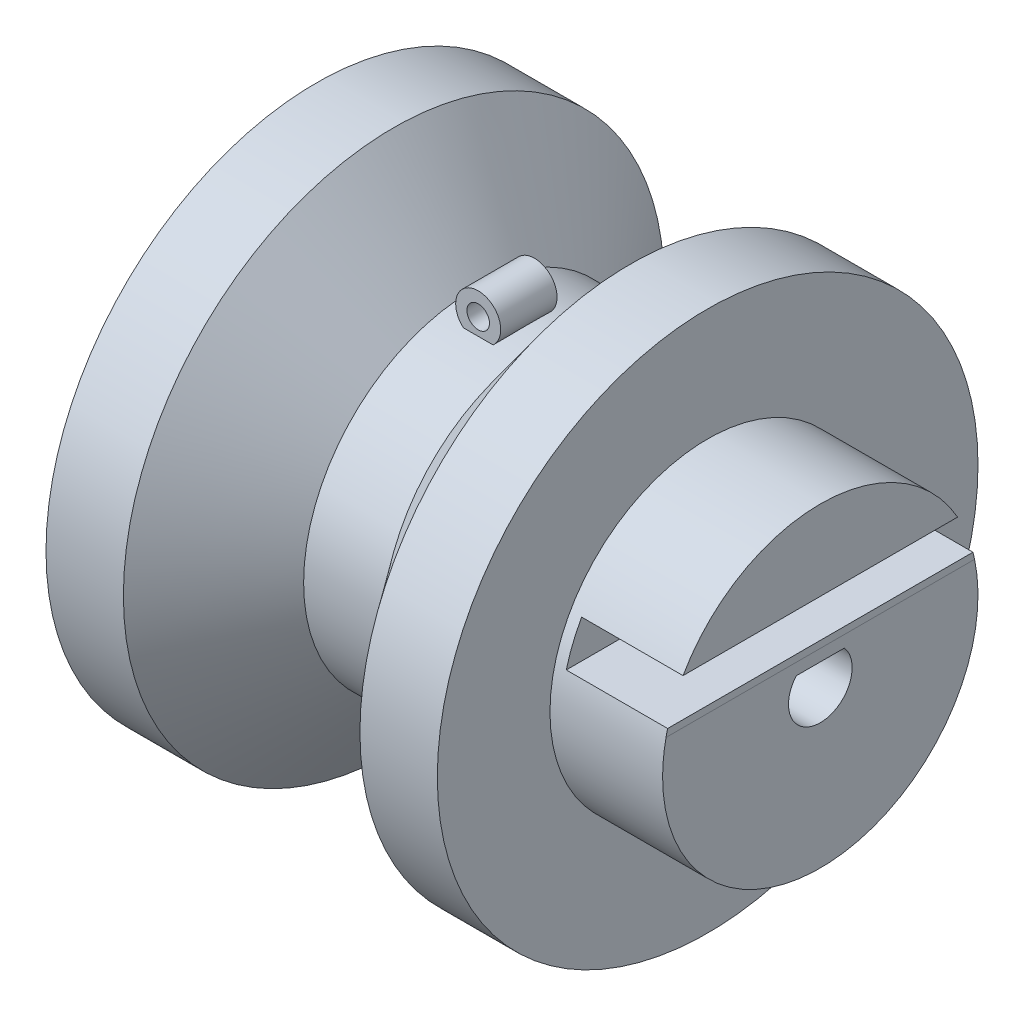
ISO-10303-21;
HEADER;
FILE_DESCRIPTION(('STEP AP214'),'2;1');
FILE_NAME('part.step','',(''),(''),'','','');
FILE_SCHEMA(('AUTOMOTIVE_DESIGN { 1 0 10303 214 1 1 1 1 }'));
ENDSEC;
DATA;
#1=APPLICATION_CONTEXT('core data for automotive mechanical design processes');
#2=APPLICATION_PROTOCOL_DEFINITION('international standard','automotive_design',2000,#1);
#3=PRODUCT_CONTEXT('',#1,'mechanical');
#4=PRODUCT('Part','Part','',(#3));
#5=PRODUCT_RELATED_PRODUCT_CATEGORY('part','',(#4));
#6=PRODUCT_DEFINITION_FORMATION('','',#4);
#7=PRODUCT_DEFINITION_CONTEXT('part definition',#1,'design');
#8=PRODUCT_DEFINITION('design','',#6,#7);
#9=PRODUCT_DEFINITION_SHAPE('','',#8);
#10=(LENGTH_UNIT() NAMED_UNIT(*) SI_UNIT(.MILLI.,.METRE.));
#11=(NAMED_UNIT(*) PLANE_ANGLE_UNIT() SI_UNIT($,.RADIAN.));
#12=(NAMED_UNIT(*) SI_UNIT($,.STERADIAN.) SOLID_ANGLE_UNIT());
#13=UNCERTAINTY_MEASURE_WITH_UNIT(LENGTH_MEASURE(1.E-05),#10,'distance_accuracy_value','');
#14=(GEOMETRIC_REPRESENTATION_CONTEXT(3) GLOBAL_UNCERTAINTY_ASSIGNED_CONTEXT((#13)) GLOBAL_UNIT_ASSIGNED_CONTEXT((#10,
#11,#12)) REPRESENTATION_CONTEXT('',''));
#15=CARTESIAN_POINT('',(0.,0.,0.));
#16=DIRECTION('',(0.,0.,1.));
#17=DIRECTION('',(1.,0.,0.));
#18=AXIS2_PLACEMENT_3D('',#15,#16,#17);
#19=CARTESIAN_POINT('',(44.74,14.,0.));
#20=DIRECTION('',(-1.,0.,0.));
#21=DIRECTION('',(0.,0.,1.));
#22=AXIS2_PLACEMENT_3D('',#19,#20,#21);
#23=PLANE('',#22);
#24=DIRECTION('',(0.,0.,-1.));
#25=VECTOR('',#24,1.);
#26=CARTESIAN_POINT('',(44.74,1.85097792377277,2.60998384332674));
#27=LINE('',#26,#25);
#28=CARTESIAN_POINT('',(44.74,1.85097792377277,2.13412879782497));
#29=VERTEX_POINT('',#28);
#30=CARTESIAN_POINT('',(44.74,1.85097792377277,-2.13412879782497));
#31=VERTEX_POINT('',#30);
#32=EDGE_CURVE('E340',#29,#31,#27,.T.);
#33=ORIENTED_EDGE('',*,*,#32,.T.);
#34=CARTESIAN_POINT('',(44.74,0.,0.));
#35=DIRECTION('',(1.,0.,0.));
#36=DIRECTION('',(0.,0.,-1.));
#37=AXIS2_PLACEMENT_3D('',#34,#35,#36);
#38=CIRCLE('',#37,2.825);
#39=EDGE_CURVE('E344',#29,#31,#38,.T.);
#40=ORIENTED_EDGE('',*,*,#39,.F.);
#41=EDGE_LOOP('',(#33,#40));
#42=FACE_BOUND('',#41,.T.);
#43=DIRECTION('',(0.,0.,-1.));
#44=VECTOR('',#43,1.);
#45=CARTESIAN_POINT('',(44.74,2.8916926259107,12.1510601448769));
#46=LINE('',#45,#44);
#47=CARTESIAN_POINT('',(44.74,2.8916926259107,13.6981062106137));
#48=VERTEX_POINT('',#47);
#49=CARTESIAN_POINT('',(44.74,2.8916926259107,-13.6981062106137));
#50=VERTEX_POINT('',#49);
#51=EDGE_CURVE('E53',#48,#50,#46,.T.);
#52=ORIENTED_EDGE('',*,*,#51,.F.);
#53=CARTESIAN_POINT('',(44.74,0.,0.));
#54=DIRECTION('',(-1.,0.,0.));
#55=DIRECTION('',(0.,0.,1.));
#56=AXIS2_PLACEMENT_3D('',#53,#54,#55);
#57=CIRCLE('',#56,14.);
#58=EDGE_CURVE('E351',#50,#48,#57,.T.);
#59=ORIENTED_EDGE('',*,*,#58,.F.);
#60=EDGE_LOOP('',(#52,#59));
#61=FACE_BOUND('',#60,.T.);
#62=ADVANCED_FACE('F39',(#42,#61),#23,.F.);
#63=CARTESIAN_POINT('',(44.74,6.8916926259107,12.1862452277134));
#64=VERTEX_POINT('',#63);
#65=CARTESIAN_POINT('',(44.74,6.8916926259107,-12.1862452277134));
#66=VERTEX_POINT('',#65);
#67=EDGE_CURVE('E349',#64,#66,#57,.T.);
#68=ORIENTED_EDGE('',*,*,#67,.F.);
#69=DIRECTION('',(0.,0.,-1.));
#70=VECTOR('',#69,1.);
#71=CARTESIAN_POINT('',(44.74,6.8916926259107,0.));
#72=LINE('',#71,#70);
#73=EDGE_CURVE('E382',#64,#66,#72,.T.);
#74=ORIENTED_EDGE('',*,*,#73,.T.);
#75=EDGE_LOOP('',(#68,#74));
#76=FACE_BOUND('',#75,.T.);
#77=ADVANCED_FACE('F245',(#76),#23,.F.);
#78=DIRECTION('',(0.,-0.973500960801579,0.228682923101842));
#79=VECTOR('',#78,1.);
#80=CARTESIAN_POINT('',(44.74,16.4685954183847,10.5087864849341));
#81=LINE('',#80,#79);
#82=CARTESIAN_POINT('',(44.74,3.50978283177401,13.5529120292941));
#83=VERTEX_POINT('',#82);
#84=EDGE_CURVE('E146',#83,#48,#81,.T.);
#85=ORIENTED_EDGE('',*,*,#84,.F.);
#86=EDGE_CURVE('E144',#48,#83,#57,.T.);
#87=ORIENTED_EDGE('',*,*,#86,.F.);
#88=EDGE_LOOP('',(#85,#87));
#89=FACE_BOUND('',#88,.T.);
#90=ADVANCED_FACE('F224',(#89),#23,.F.);
#91=CARTESIAN_POINT('',(35.74,0.,0.));
#92=DIRECTION('',(1.,0.,0.));
#93=DIRECTION('',(0.,0.,-1.));
#94=AXIS2_PLACEMENT_3D('',#91,#92,#93);
#95=PLANE('',#94);
#96=DIRECTION('',(0.,0.,1.));
#97=VECTOR('',#96,1.);
#98=CARTESIAN_POINT('',(35.74,6.8916926259107,12.1510601448769));
#99=LINE('',#98,#97);
#100=CARTESIAN_POINT('',(35.74,6.8916926259107,-12.1862452277134));
#101=VERTEX_POINT('',#100);
#102=CARTESIAN_POINT('',(35.74,6.8916926259107,12.1862452277134));
#103=VERTEX_POINT('',#102);
#104=EDGE_CURVE('E136',#101,#103,#99,.T.);
#105=ORIENTED_EDGE('',*,*,#104,.T.);
#106=CARTESIAN_POINT('',(35.74,0.,0.));
#107=DIRECTION('',(-1.,0.,0.));
#108=DIRECTION('',(0.,0.,1.));
#109=AXIS2_PLACEMENT_3D('',#106,#107,#108);
#110=CIRCLE('',#109,14.);
#111=CARTESIAN_POINT('',(35.74,3.50978283177401,13.5529120292941));
#112=VERTEX_POINT('',#111);
#113=EDGE_CURVE('E133',#112,#103,#110,.T.);
#114=ORIENTED_EDGE('',*,*,#113,.F.);
#115=DIRECTION('',(0.,0.,1.));
#116=VECTOR('',#115,1.);
#117=CARTESIAN_POINT('',(35.74,3.50978283177401,13.5529120292941));
#118=LINE('',#117,#116);
#119=CARTESIAN_POINT('',(35.74,3.50978283177401,-13.5529120292941));
#120=VERTEX_POINT('',#119);
#121=EDGE_CURVE('E61',#120,#112,#118,.T.);
#122=ORIENTED_EDGE('',*,*,#121,.F.);
#123=CARTESIAN_POINT('',(35.74,0.,0.));
#124=DIRECTION('',(1.,0.,0.));
#125=DIRECTION('',(0.,0.,-1.));
#126=AXIS2_PLACEMENT_3D('',#123,#124,#125);
#127=CIRCLE('',#126,14.);
#128=EDGE_CURVE('E385',#120,#101,#127,.T.);
#129=ORIENTED_EDGE('',*,*,#128,.T.);
#130=EDGE_LOOP('',(#105,#114,#122,#129));
#131=FACE_BOUND('',#130,.T.);
#132=ADVANCED_FACE('F134',(#131),#95,.T.);
#133=CARTESIAN_POINT('',(-743.156397809563,0.,0.));
#134=DIRECTION('',(-1.,0.,0.));
#135=DIRECTION('',(0.,0.,1.));
#136=AXIS2_PLACEMENT_3D('',#133,#134,#135);
#137=CYLINDRICAL_SURFACE('',#136,15.);
#138=CARTESIAN_POINT('',(20.8700000000001,0.,0.));
#139=DIRECTION('',(-1.,0.,0.));
#140=DIRECTION('',(0.,0.,1.));
#141=AXIS2_PLACEMENT_3D('',#138,#139,#140);
#142=CIRCLE('',#141,15.);
#143=CARTESIAN_POINT('',(20.8700000000001,0.,15.));
#144=VERTEX_POINT('',#143);
#145=EDGE_CURVE('E362',#144,#144,#142,.T.);
#146=ORIENTED_EDGE('',*,*,#145,.T.);
#147=EDGE_LOOP('',(#146));
#148=FACE_BOUND('',#147,.T.);
#149=CARTESIAN_POINT('',(13.87,0.,0.));
#150=DIRECTION('',(-1.,0.,0.));
#151=DIRECTION('',(0.,0.,1.));
#152=AXIS2_PLACEMENT_3D('',#149,#150,#151);
#153=CIRCLE('',#152,15.);
#154=CARTESIAN_POINT('',(13.87,0.,15.));
#155=VERTEX_POINT('',#154);
#156=EDGE_CURVE('E365',#155,#155,#153,.T.);
#157=ORIENTED_EDGE('',*,*,#156,.F.);
#158=EDGE_LOOP('',(#157));
#159=FACE_BOUND('',#158,.T.);
#160=CARTESIAN_POINT('',(18.6893960728491,14.6969384566991,3.));
#161=CARTESIAN_POINT('',(18.7040610291489,14.7098161919238,2.93691462350065));
#162=CARTESIAN_POINT('',(18.717882698051,14.7223238782577,2.87356435946661));
#163=CARTESIAN_POINT('',(18.7439977964036,14.7465728184512,2.74641139489665));
#164=CARTESIAN_POINT('',(18.7562914100933,14.758314164628,2.6826087498872));
#165=CARTESIAN_POINT('',(18.7911096736137,14.7923411112686,2.49068646675242));
#166=CARTESIAN_POINT('',(18.811587700297,14.8134439978394,2.3619821585127));
#167=CARTESIAN_POINT('',(18.8480076298798,14.8523352513787,2.10361316019437));
#168=CARTESIAN_POINT('',(18.8639549844343,14.8701275928746,1.97394981860906));
#169=CARTESIAN_POINT('',(18.892026407053,14.9023533787343,1.71378346857584));
#170=CARTESIAN_POINT('',(18.9041499055225,14.9167863226045,1.58328033798597));
#171=CARTESIAN_POINT('',(18.9352445676458,14.954568877835,1.19490664119092));
#172=CARTESIAN_POINT('',(18.9494671984609,14.9730062785305,0.936157608819902));
#173=CARTESIAN_POINT('',(18.9673812871013,14.9964312981597,0.417656023941576));
#174=CARTESIAN_POINT('',(18.9710702115417,15.0014156815907,0.15790324506921));
#175=CARTESIAN_POINT('',(18.968930743925,14.9985813195935,-0.260063844880724));
#176=CARTESIAN_POINT('',(18.9662550448626,14.9950003885739,-0.418338908711629));
#177=CARTESIAN_POINT('',(18.957004475162,14.9828396607237,-0.734529680897843));
#178=CARTESIAN_POINT('',(18.9504310464235,14.9742617124765,-0.892445500474776));
#179=CARTESIAN_POINT('',(18.9329409787209,14.9520341102201,-1.20917778892372));
#180=CARTESIAN_POINT('',(18.9219842731021,14.9383377480735,-1.36798885775123));
#181=CARTESIAN_POINT('',(18.9018015469766,14.9140399759554,-1.60553861995131));
#182=CARTESIAN_POINT('',(18.8944466685123,14.9053120874341,-1.68463370127467));
#183=CARTESIAN_POINT('',(18.8783681457212,14.8866169198247,-1.8425416596438));
#184=CARTESIAN_POINT('',(18.8696444296127,14.8766495757454,-1.92135452166819));
#185=CARTESIAN_POINT('',(18.8601769737583,14.8660687473185,-2.));
#186=B_SPLINE_CURVE_WITH_KNOTS('',3,(#160,#161,#162,#163,#164,#165,#166,#167,#168,#169,#170,
#171,#172,#173,#174,#175,#176,#177,#178,#179,#180,#181,#182,#183,#184,#185),.UNSPECIFIED.,.F.,
.F.,(4,2,2,2,2,2,2,2,2,2,2,2,4),(0.,0.198088605508149,0.396153304062786,0.792062376956047,
1.18749302400516,1.58298254591454,2.36171158582709,3.14062789640457,3.61552926173727,
4.0902550547849,4.56942316790253,4.80914707619131,5.04888355978083),.UNSPECIFIED.);
#187=CARTESIAN_POINT('',(18.6893960728491,14.6969384566991,3.));
#188=VERTEX_POINT('',#187);
#189=CARTESIAN_POINT('',(18.8601769737583,14.8660687473185,-2.));
#190=VERTEX_POINT('',#189);
#191=EDGE_CURVE('E148',#188,#190,#186,.T.);
#192=ORIENTED_EDGE('',*,*,#191,.F.);
#193=DIRECTION('',(-1.,0.,0.));
#194=VECTOR('',#193,1.);
#195=CARTESIAN_POINT('',(-743.156397809563,14.6969384566991,3.));
#196=LINE('',#195,#194);
#197=CARTESIAN_POINT('',(16.050603927151,14.6969384566991,3.));
#198=VERTEX_POINT('',#197);
#199=EDGE_CURVE('E200',#188,#198,#196,.T.);
#200=ORIENTED_EDGE('',*,*,#199,.T.);
#201=CARTESIAN_POINT('',(15.8798230262418,14.8660687473185,-2.));
#202=CARTESIAN_POINT('',(15.870375643507,14.8766270802858,-1.9215216609567));
#203=CARTESIAN_POINT('',(15.8616689143144,14.8865745429538,-1.84287668048276));
#204=CARTESIAN_POINT('',(15.8456188311979,14.9052352066879,-1.68530583199752));
#205=CARTESIAN_POINT('',(15.8382754013861,14.9139484764487,-1.60637997987031));
#206=CARTESIAN_POINT('',(15.8181146414368,14.938216385277,-1.36928069895072));
#207=CARTESIAN_POINT('',(15.8071628630908,14.9519036939852,-1.21075161133191));
#208=CARTESIAN_POINT('',(15.789578736239,14.974247761487,-0.892925909158902));
#209=CARTESIAN_POINT('',(15.7829514145344,14.9828986646472,-0.733628617449837));
#210=CARTESIAN_POINT('',(15.7736569738617,14.9951149920446,-0.414716800602474));
#211=CARTESIAN_POINT('',(15.7709900328092,14.9986801878117,-0.255102261534717));
#212=CARTESIAN_POINT('',(15.7694811569605,15.0006916826448,0.060943090110886));
#213=CARTESIAN_POINT('',(15.7705628586212,14.9992401784582,0.217372920525811));
#214=CARTESIAN_POINT('',(15.7764422770488,14.9914479284801,0.530040534257766));
#215=CARTESIAN_POINT('',(15.7812399412347,14.9851072518704,0.686278320260896));
#216=CARTESIAN_POINT('',(15.7948098733402,14.9675637502191,0.998209687963734));
#217=CARTESIAN_POINT('',(15.8035796174892,14.9563640127058,1.15390355205718));
#218=CARTESIAN_POINT('',(15.8255772870003,14.9291469263377,1.46453795288114));
#219=CARTESIAN_POINT('',(15.838804471217,14.9131303784289,1.6194786105067));
#220=CARTESIAN_POINT('',(15.865236201923,14.8824467731514,1.87712406404114));
#221=CARTESIAN_POINT('',(15.8769975966152,14.8690893717887,1.98013505242891));
#222=CARTESIAN_POINT('',(15.9031739383018,14.8402944410675,2.18549976850785));
#223=CARTESIAN_POINT('',(15.9175881088593,14.8248575207136,2.28785367946993));
#224=CARTESIAN_POINT('',(15.9495726704717,14.7918360028383,2.49246692795308));
#225=CARTESIAN_POINT('',(15.9671641230574,14.774237341009,2.59472075519171));
#226=CARTESIAN_POINT('',(16.006002261356,14.7370550351076,2.7982025998532));
#227=CARTESIAN_POINT('',(16.0272502241691,14.7174706984888,2.89943024573956));
#228=CARTESIAN_POINT('',(16.0506039271507,14.6969384566991,3.00000000000003));
#229=B_SPLINE_CURVE_WITH_KNOTS('',3,(#201,#202,#203,#204,#205,#206,#207,#208,#209,#210,#211,
#212,#213,#214,#215,#216,#217,#218,#219,#220,#221,#222,#223,#224,#225,#226,#227,#228),
.UNSPECIFIED.,.F.,.F.,(4,2,2,2,2,2,2,2,2,2,2,2,2,4),(0.,0.23922696357834,0.47844060664154,
0.95676457673524,1.43564357062519,1.91454407696938,2.38374674771456,2.85294277935444,
3.32184111164863,3.79066151793414,4.10422394537538,4.41769474226264,4.73332529385628,
5.04906630952006),.UNSPECIFIED.);
#230=CARTESIAN_POINT('',(15.8798230262418,14.8660687473185,-2.));
#231=VERTEX_POINT('',#230);
#232=EDGE_CURVE('E187',#231,#198,#229,.T.);
#233=ORIENTED_EDGE('',*,*,#232,.F.);
#234=DIRECTION('',(-1.,0.,0.));
#235=VECTOR('',#234,1.);
#236=CARTESIAN_POINT('',(-743.156397809563,14.8660687473185,-2.));
#237=LINE('',#236,#235);
#238=EDGE_CURVE('E321',#190,#231,#237,.T.);
#239=ORIENTED_EDGE('',*,*,#238,.F.);
#240=EDGE_LOOP('',(#192,#200,#233,#239));
#241=FACE_BOUND('',#240,.T.);
#242=ADVANCED_FACE('F180',(#148,#159,#241),#137,.T.);
#243=CARTESIAN_POINT('',(0.,0.,0.));
#244=DIRECTION('',(1.,0.,0.));
#245=DIRECTION('',(0.,0.,-1.));
#246=AXIS2_PLACEMENT_3D('',#243,#244,#245);
#247=PLANE('',#246);
#248=CARTESIAN_POINT('',(0.,0.,0.));
#249=DIRECTION('',(-1.,0.,0.));
#250=DIRECTION('',(0.,0.,1.));
#251=AXIS2_PLACEMENT_3D('',#248,#249,#250);
#252=CIRCLE('',#251,24.);
#253=CARTESIAN_POINT('',(0.,0.,24.));
#254=VERTEX_POINT('',#253);
#255=EDGE_CURVE('E371',#254,#254,#252,.T.);
#256=ORIENTED_EDGE('',*,*,#255,.T.);
#257=EDGE_LOOP('',(#256));
#258=FACE_BOUND('',#257,.T.);
#259=ADVANCED_FACE('F41',(#258),#247,.F.);
#260=CARTESIAN_POINT('',(-743.156397809563,0.,0.));
#261=DIRECTION('',(-1.,0.,0.));
#262=DIRECTION('',(0.,0.,1.));
#263=AXIS2_PLACEMENT_3D('',#260,#261,#262);
#264=CYLINDRICAL_SURFACE('',#263,24.);
#265=ORIENTED_EDGE('',*,*,#255,.F.);
#266=EDGE_LOOP('',(#265));
#267=FACE_BOUND('',#266,.T.);
#268=CARTESIAN_POINT('',(6.87000000000004,0.,0.));
#269=DIRECTION('',(-1.,0.,0.));
#270=DIRECTION('',(0.,0.,1.));
#271=AXIS2_PLACEMENT_3D('',#268,#269,#270);
#272=CIRCLE('',#271,24.);
#273=CARTESIAN_POINT('',(6.87000000000004,0.,24.));
#274=VERTEX_POINT('',#273);
#275=EDGE_CURVE('E368',#274,#274,#272,.T.);
#276=ORIENTED_EDGE('',*,*,#275,.T.);
#277=EDGE_LOOP('',(#276));
#278=FACE_BOUND('',#277,.T.);
#279=ADVANCED_FACE('F521',(#267,#278),#264,.T.);
#280=CARTESIAN_POINT('',(13.87,0.,0.));
#281=DIRECTION('',(-1.,0.,0.));
#282=DIRECTION('',(0.,0.,1.));
#283=AXIS2_PLACEMENT_3D('',#280,#281,#282);
#284=CONICAL_SURFACE('',#283,15.,0.909753157944209);
#285=ORIENTED_EDGE('',*,*,#275,.F.);
#286=EDGE_LOOP('',(#285));
#287=FACE_BOUND('',#286,.T.);
#288=ORIENTED_EDGE('',*,*,#156,.T.);
#289=EDGE_LOOP('',(#288));
#290=FACE_BOUND('',#289,.T.);
#291=ADVANCED_FACE('F178',(#287,#290),#284,.T.);
#292=CARTESIAN_POINT('',(27.87,0.,0.));
#293=DIRECTION('',(1.,0.,0.));
#294=DIRECTION('',(0.,0.,-1.));
#295=AXIS2_PLACEMENT_3D('',#292,#293,#294);
#296=CONICAL_SURFACE('',#295,24.,0.909753157944217);
#297=ORIENTED_EDGE('',*,*,#145,.F.);
#298=EDGE_LOOP('',(#297));
#299=FACE_BOUND('',#298,.T.);
#300=CARTESIAN_POINT('',(27.87,0.,0.));
#301=DIRECTION('',(-1.,0.,0.));
#302=DIRECTION('',(0.,0.,1.));
#303=AXIS2_PLACEMENT_3D('',#300,#301,#302);
#304=CIRCLE('',#303,24.);
#305=CARTESIAN_POINT('',(27.87,0.,24.));
#306=VERTEX_POINT('',#305);
#307=EDGE_CURVE('E359',#306,#306,#304,.T.);
#308=ORIENTED_EDGE('',*,*,#307,.T.);
#309=EDGE_LOOP('',(#308));
#310=FACE_BOUND('',#309,.T.);
#311=ADVANCED_FACE('F174',(#299,#310),#296,.T.);
#312=CARTESIAN_POINT('',(-743.156397809563,0.,0.));
#313=DIRECTION('',(-1.,0.,0.));
#314=DIRECTION('',(0.,0.,1.));
#315=AXIS2_PLACEMENT_3D('',#312,#313,#314);
#316=CYLINDRICAL_SURFACE('',#315,24.);
#317=ORIENTED_EDGE('',*,*,#307,.F.);
#318=EDGE_LOOP('',(#317));
#319=FACE_BOUND('',#318,.T.);
#320=CARTESIAN_POINT('',(34.74,0.,0.));
#321=DIRECTION('',(-1.,0.,0.));
#322=DIRECTION('',(0.,0.,1.));
#323=AXIS2_PLACEMENT_3D('',#320,#321,#322);
#324=CIRCLE('',#323,24.);
#325=CARTESIAN_POINT('',(34.74,0.,24.));
#326=VERTEX_POINT('',#325);
#327=EDGE_CURVE('E356',#326,#326,#324,.T.);
#328=ORIENTED_EDGE('',*,*,#327,.T.);
#329=EDGE_LOOP('',(#328));
#330=FACE_BOUND('',#329,.T.);
#331=ADVANCED_FACE('F170',(#319,#330),#316,.T.);
#332=CARTESIAN_POINT('',(34.74,24.,0.));
#333=DIRECTION('',(-1.,0.,0.));
#334=DIRECTION('',(0.,0.,1.));
#335=AXIS2_PLACEMENT_3D('',#332,#333,#334);
#336=PLANE('',#335);
#337=ORIENTED_EDGE('',*,*,#327,.F.);
#338=EDGE_LOOP('',(#337));
#339=FACE_BOUND('',#338,.T.);
#340=CARTESIAN_POINT('',(34.74,0.,0.));
#341=DIRECTION('',(-1.,0.,0.));
#342=DIRECTION('',(0.,0.,1.));
#343=AXIS2_PLACEMENT_3D('',#340,#341,#342);
#344=CIRCLE('',#343,14.);
#345=CARTESIAN_POINT('',(34.74,0.,14.));
#346=VERTEX_POINT('',#345);
#347=EDGE_CURVE('E353',#346,#346,#344,.T.);
#348=ORIENTED_EDGE('',*,*,#347,.T.);
#349=EDGE_LOOP('',(#348));
#350=FACE_BOUND('',#349,.T.);
#351=ADVANCED_FACE('F166',(#339,#350),#336,.F.);
#352=CARTESIAN_POINT('',(-743.156397809563,0.,0.));
#353=DIRECTION('',(-1.,0.,0.));
#354=DIRECTION('',(0.,0.,1.));
#355=AXIS2_PLACEMENT_3D('',#352,#353,#354);
#356=CYLINDRICAL_SURFACE('',#355,14.);
#357=ORIENTED_EDGE('',*,*,#113,.T.);
#358=DIRECTION('',(-1.,0.,0.));
#359=VECTOR('',#358,1.);
#360=CARTESIAN_POINT('',(-743.156397809563,6.8916926259107,12.1862452277134));
#361=LINE('',#360,#359);
#362=EDGE_CURVE('E12',#103,#64,#361,.F.);
#363=ORIENTED_EDGE('',*,*,#362,.T.);
#364=ORIENTED_EDGE('',*,*,#67,.T.);
#365=DIRECTION('',(-1.,0.,0.));
#366=VECTOR('',#365,1.);
#367=CARTESIAN_POINT('',(-743.156397809563,6.8916926259107,-12.1862452277134));
#368=LINE('',#367,#366);
#369=EDGE_CURVE('E337',#66,#101,#368,.T.);
#370=ORIENTED_EDGE('',*,*,#369,.T.);
#371=ORIENTED_EDGE('',*,*,#128,.F.);
#372=CARTESIAN_POINT('',(35.74,2.8916926259107,-13.6981062106137));
#373=DIRECTION('',(0.,0.973500960801579,0.228682923101842));
#374=VECTOR('',#373,1.);
#375=LINE('',#372,#374);
#376=CARTESIAN_POINT('',(35.74,2.8916926259107,-13.6981062106137));
#377=VERTEX_POINT('',#376);
#378=EDGE_CURVE('E130',#377,#120,#375,.T.);
#379=ORIENTED_EDGE('',*,*,#378,.F.);
#380=DIRECTION('',(1.,0.,0.));
#381=VECTOR('',#380,1.);
#382=CARTESIAN_POINT('',(35.74,2.8916926259107,-13.6981062106137));
#383=LINE('',#382,#381);
#384=EDGE_CURVE('E335',#377,#50,#383,.T.);
#385=ORIENTED_EDGE('',*,*,#384,.T.);
#386=ORIENTED_EDGE('',*,*,#58,.T.);
#387=ORIENTED_EDGE('',*,*,#86,.T.);
#388=DIRECTION('',(-1.,0.,0.));
#389=VECTOR('',#388,1.);
#390=CARTESIAN_POINT('',(-743.156397809563,3.50978283177401,13.5529120292941));
#391=LINE('',#390,#389);
#392=EDGE_CURVE('E47',#83,#112,#391,.T.);
#393=ORIENTED_EDGE('',*,*,#392,.T.);
#394=EDGE_LOOP('',(#357,#363,#364,#370,#371,#379,#385,#386,#387,#393));
#395=FACE_BOUND('',#394,.T.);
#396=ORIENTED_EDGE('',*,*,#347,.F.);
#397=EDGE_LOOP('',(#396));
#398=FACE_BOUND('',#397,.T.);
#399=ADVANCED_FACE('F141',(#395,#398),#356,.T.);
#400=CARTESIAN_POINT('',(9.74,0.,0.));
#401=DIRECTION('',(1.,0.,0.));
#402=DIRECTION('',(0.,0.,-1.));
#403=AXIS2_PLACEMENT_3D('',#400,#401,#402);
#404=CYLINDRICAL_SURFACE('',#403,2.825);
#405=ORIENTED_EDGE('',*,*,#39,.T.);
#406=DIRECTION('',(1.,0.,0.));
#407=VECTOR('',#406,1.);
#408=CARTESIAN_POINT('',(9.74,1.85097792377277,-2.13412879782497));
#409=LINE('',#408,#407);
#410=CARTESIAN_POINT('',(14.74,1.85097792377277,-2.13412879782497));
#411=VERTEX_POINT('',#410);
#412=EDGE_CURVE('E379',#31,#411,#409,.F.);
#413=ORIENTED_EDGE('',*,*,#412,.T.);
#414=CARTESIAN_POINT('',(14.74,0.,0.));
#415=DIRECTION('',(1.,0.,0.));
#416=DIRECTION('',(0.,0.,-1.));
#417=AXIS2_PLACEMENT_3D('',#414,#415,#416);
#418=CIRCLE('',#417,2.825);
#419=CARTESIAN_POINT('',(14.74,1.85097792377277,2.13412879782497));
#420=VERTEX_POINT('',#419);
#421=EDGE_CURVE('E374',#420,#411,#418,.F.);
#422=ORIENTED_EDGE('',*,*,#421,.F.);
#423=DIRECTION('',(1.,0.,0.));
#424=VECTOR('',#423,1.);
#425=CARTESIAN_POINT('',(9.74,1.85097792377277,2.13412879782497));
#426=LINE('',#425,#424);
#427=EDGE_CURVE('E376',#420,#29,#426,.T.);
#428=ORIENTED_EDGE('',*,*,#427,.T.);
#429=EDGE_LOOP('',(#405,#413,#422,#428));
#430=FACE_BOUND('',#429,.T.);
#431=CARTESIAN_POINT('',(9.74,0.,0.));
#432=DIRECTION('',(1.,0.,0.));
#433=DIRECTION('',(0.,0.,-1.));
#434=AXIS2_PLACEMENT_3D('',#431,#432,#433);
#435=CIRCLE('',#434,2.825);
#436=CARTESIAN_POINT('',(9.74,0.,-2.825));
#437=VERTEX_POINT('',#436);
#438=EDGE_CURVE('E346',#437,#437,#435,.T.);
#439=ORIENTED_EDGE('',*,*,#438,.F.);
#440=EDGE_LOOP('',(#439));
#441=FACE_BOUND('',#440,.T.);
#442=ADVANCED_FACE('F165',(#430,#441),#404,.F.);
#443=CARTESIAN_POINT('',(9.74,0.,0.));
#444=DIRECTION('',(1.,0.,0.));
#445=DIRECTION('',(0.,0.,-1.));
#446=AXIS2_PLACEMENT_3D('',#443,#444,#445);
#447=PLANE('',#446);
#448=ORIENTED_EDGE('',*,*,#438,.T.);
#449=EDGE_LOOP('',(#448));
#450=FACE_BOUND('',#449,.T.);
#451=ADVANCED_FACE('F235',(#450),#447,.T.);
#452=CARTESIAN_POINT('',(14.74,1.85097792377277,2.60998384332674));
#453=DIRECTION('',(0.,-1.,0.));
#454=DIRECTION('',(0.,0.,-1.));
#455=AXIS2_PLACEMENT_3D('',#452,#453,#454);
#456=PLANE('',#455);
#457=CARTESIAN_POINT('',(29.9566790366801,1.85097792377277,0.));
#458=DIRECTION('',(0.,-1.,0.));
#459=DIRECTION('',(0.,0.,-1.));
#460=AXIS2_PLACEMENT_3D('',#457,#458,#459);
#461=CIRCLE('',#460,1.43);
#462=CARTESIAN_POINT('',(29.9566790366801,1.85097792377277,-1.43));
#463=VERTEX_POINT('',#462);
#464=EDGE_CURVE('E328',#463,#463,#461,.T.);
#465=ORIENTED_EDGE('',*,*,#464,.F.);
#466=EDGE_LOOP('',(#465));
#467=FACE_BOUND('',#466,.T.);
#468=ORIENTED_EDGE('',*,*,#412,.F.);
#469=ORIENTED_EDGE('',*,*,#32,.F.);
#470=ORIENTED_EDGE('',*,*,#427,.F.);
#471=DIRECTION('',(0.,0.,-1.));
#472=VECTOR('',#471,1.);
#473=CARTESIAN_POINT('',(14.74,1.85097792377277,2.60998384332674));
#474=LINE('',#473,#472);
#475=EDGE_CURVE('E341',#420,#411,#474,.T.);
#476=ORIENTED_EDGE('',*,*,#475,.T.);
#477=EDGE_LOOP('',(#468,#469,#470,#476));
#478=FACE_BOUND('',#477,.T.);
#479=ADVANCED_FACE('F231',(#467,#478),#456,.T.);
#480=CARTESIAN_POINT('',(14.74,0.,0.));
#481=DIRECTION('',(1.,0.,0.));
#482=DIRECTION('',(0.,0.,-1.));
#483=AXIS2_PLACEMENT_3D('',#480,#481,#482);
#484=PLANE('',#483);
#485=ORIENTED_EDGE('',*,*,#421,.T.);
#486=ORIENTED_EDGE('',*,*,#475,.F.);
#487=EDGE_LOOP('',(#485,#486));
#488=FACE_BOUND('',#487,.T.);
#489=ADVANCED_FACE('F227',(#488),#484,.F.);
#490=CARTESIAN_POINT('',(35.74,6.8916926259107,12.1510601448769));
#491=DIRECTION('',(0.,1.,0.));
#492=DIRECTION('',(0.,0.,1.));
#493=AXIS2_PLACEMENT_3D('',#490,#491,#492);
#494=PLANE('',#493);
#495=ORIENTED_EDGE('',*,*,#73,.F.);
#496=ORIENTED_EDGE('',*,*,#362,.F.);
#497=ORIENTED_EDGE('',*,*,#104,.F.);
#498=ORIENTED_EDGE('',*,*,#369,.F.);
#499=EDGE_LOOP('',(#495,#496,#497,#498));
#500=FACE_BOUND('',#499,.T.);
#501=ADVANCED_FACE('F220',(#500),#494,.F.);
#502=CARTESIAN_POINT('',(29.9566790366801,0.,0.));
#503=DIRECTION('',(0.,1.,0.));
#504=DIRECTION('',(0.,0.,1.));
#505=AXIS2_PLACEMENT_3D('',#502,#503,#504);
#506=CYLINDRICAL_SURFACE('',#505,1.43);
#507=ORIENTED_EDGE('',*,*,#464,.T.);
#508=EDGE_LOOP('',(#507));
#509=FACE_BOUND('',#508,.T.);
#510=CARTESIAN_POINT('',(29.9566790366801,22.,0.));
#511=DIRECTION('',(0.,1.,0.));
#512=DIRECTION('',(0.,0.,1.));
#513=AXIS2_PLACEMENT_3D('',#510,#511,#512);
#514=CIRCLE('',#513,1.43);
#515=CARTESIAN_POINT('',(29.9566790366801,22.,1.43));
#516=VERTEX_POINT('',#515);
#517=EDGE_CURVE('E324',#516,#516,#514,.T.);
#518=ORIENTED_EDGE('',*,*,#517,.T.);
#519=EDGE_LOOP('',(#518));
#520=FACE_BOUND('',#519,.T.);
#521=ADVANCED_FACE('F216',(#509,#520),#506,.F.);
#522=CARTESIAN_POINT('',(29.9566790366801,22.,0.));
#523=DIRECTION('',(0.,1.,0.));
#524=DIRECTION('',(0.,0.,1.));
#525=AXIS2_PLACEMENT_3D('',#522,#523,#524);
#526=PLANE('',#525);
#527=ORIENTED_EDGE('',*,*,#517,.F.);
#528=EDGE_LOOP('',(#527));
#529=FACE_BOUND('',#528,.T.);
#530=ADVANCED_FACE('F211',(#529),#526,.F.);
#531=CARTESIAN_POINT('',(17.3700000000001,16.2000000000001,3.));
#532=DIRECTION('',(0.,0.,1.));
#533=DIRECTION('',(1.,0.,0.));
#534=AXIS2_PLACEMENT_3D('',#531,#532,#533);
#535=PLANE('',#534);
#536=CARTESIAN_POINT('',(17.3700000000001,16.2000000000001,3.));
#537=DIRECTION('',(0.,0.,1.));
#538=DIRECTION('',(1.,0.,0.));
#539=AXIS2_PLACEMENT_3D('',#536,#537,#538);
#540=CIRCLE('',#539,1.);
#541=CARTESIAN_POINT('',(18.3700000000001,16.2000000000001,3.));
#542=VERTEX_POINT('',#541);
#543=EDGE_CURVE('E314',#542,#542,#540,.T.);
#544=ORIENTED_EDGE('',*,*,#543,.F.);
#545=EDGE_LOOP('',(#544));
#546=FACE_BOUND('',#545,.T.);
#547=ORIENTED_EDGE('',*,*,#199,.F.);
#548=CARTESIAN_POINT('',(17.3700000000001,16.2000000000001,3.));
#549=DIRECTION('',(0.,0.,1.));
#550=DIRECTION('',(1.,0.,0.));
#551=AXIS2_PLACEMENT_3D('',#548,#549,#550);
#552=CIRCLE('',#551,2.);
#553=EDGE_CURVE('E318',#188,#198,#552,.T.);
#554=ORIENTED_EDGE('',*,*,#553,.T.);
#555=EDGE_LOOP('',(#547,#554));
#556=FACE_BOUND('',#555,.T.);
#557=ADVANCED_FACE('F215',(#546,#556),#535,.T.);
#558=CARTESIAN_POINT('',(17.3700000000001,16.2000000000001,-2.));
#559=DIRECTION('',(0.,0.,1.));
#560=DIRECTION('',(1.,0.,0.));
#561=AXIS2_PLACEMENT_3D('',#558,#559,#560);
#562=PLANE('',#561);
#563=CARTESIAN_POINT('',(17.3700000000001,16.2000000000001,-2.));
#564=DIRECTION('',(0.,0.,1.));
#565=DIRECTION('',(1.,0.,0.));
#566=AXIS2_PLACEMENT_3D('',#563,#564,#565);
#567=CIRCLE('',#566,1.);
#568=CARTESIAN_POINT('',(18.3700000000001,16.2000000000001,-2.));
#569=VERTEX_POINT('',#568);
#570=EDGE_CURVE('E279',#569,#569,#567,.T.);
#571=ORIENTED_EDGE('',*,*,#570,.T.);
#572=EDGE_LOOP('',(#571));
#573=FACE_BOUND('',#572,.T.);
#574=CARTESIAN_POINT('',(17.3700000000001,16.2000000000001,-2.));
#575=DIRECTION('',(0.,0.,1.));
#576=DIRECTION('',(1.,0.,0.));
#577=AXIS2_PLACEMENT_3D('',#574,#575,#576);
#578=CIRCLE('',#577,2.);
#579=EDGE_CURVE('E325',#190,#231,#578,.T.);
#580=ORIENTED_EDGE('',*,*,#579,.F.);
#581=ORIENTED_EDGE('',*,*,#238,.T.);
#582=EDGE_LOOP('',(#580,#581));
#583=FACE_BOUND('',#582,.T.);
#584=ADVANCED_FACE('F208',(#573,#583),#562,.F.);
#585=CARTESIAN_POINT('',(17.3700000000001,16.2000000000001,3.));
#586=DIRECTION('',(0.,0.,-1.));
#587=DIRECTION('',(-1.,0.,0.));
#588=AXIS2_PLACEMENT_3D('',#585,#586,#587);
#589=CYLINDRICAL_SURFACE('',#588,2.);
#590=ORIENTED_EDGE('',*,*,#553,.F.);
#591=ORIENTED_EDGE('',*,*,#191,.T.);
#592=ORIENTED_EDGE('',*,*,#579,.T.);
#593=ORIENTED_EDGE('',*,*,#232,.T.);
#594=EDGE_LOOP('',(#590,#591,#592,#593));
#595=FACE_BOUND('',#594,.T.);
#596=ADVANCED_FACE('F202',(#595),#589,.T.);
#597=CARTESIAN_POINT('',(17.3700000000001,16.2000000000001,3.));
#598=DIRECTION('',(0.,0.,-1.));
#599=DIRECTION('',(-1.,0.,0.));
#600=AXIS2_PLACEMENT_3D('',#597,#598,#599);
#601=CYLINDRICAL_SURFACE('',#600,1.);
#602=ORIENTED_EDGE('',*,*,#543,.T.);
#603=EDGE_LOOP('',(#602));
#604=FACE_BOUND('',#603,.T.);
#605=ORIENTED_EDGE('',*,*,#570,.F.);
#606=EDGE_LOOP('',(#605));
#607=FACE_BOUND('',#606,.T.);
#608=ADVANCED_FACE('F207',(#604,#607),#601,.F.);
#609=CARTESIAN_POINT('',(44.7401,2.8916926259107,13.6981062106137));
#610=DIRECTION('',(0.,-0.228682923101842,-0.973500960801579));
#611=DIRECTION('',(0.,0.973500960801579,-0.228682923101842));
#612=AXIS2_PLACEMENT_3D('',#609,#610,#611);
#613=PLANE('',#612);
#614=DIRECTION('',(-1.,0.,0.));
#615=VECTOR('',#614,1.);
#616=CARTESIAN_POINT('',(44.7401,3.50978283177401,13.5529120292941));
#617=LINE('',#616,#615);
#618=CARTESIAN_POINT('',(44.7401,3.50978283177401,13.5529120292941));
#619=VERTEX_POINT('',#618);
#620=EDGE_CURVE('E263',#619,#83,#617,.T.);
#621=ORIENTED_EDGE('',*,*,#620,.T.);
#622=ORIENTED_EDGE('',*,*,#84,.T.);
#623=DIRECTION('',(-1.,0.,0.));
#624=VECTOR('',#623,1.);
#625=CARTESIAN_POINT('',(44.7401,2.8916926259107,13.6981062106137));
#626=LINE('',#625,#624);
#627=CARTESIAN_POINT('',(44.7401,2.8916926259107,13.6981062106137));
#628=VERTEX_POINT('',#627);
#629=EDGE_CURVE('E261',#628,#48,#626,.T.);
#630=ORIENTED_EDGE('',*,*,#629,.F.);
#631=DIRECTION('',(0.,-0.973500960801579,0.228682923101842));
#632=VECTOR('',#631,1.);
#633=CARTESIAN_POINT('',(44.7401,2.8916926259107,13.6981062106137));
#634=LINE('',#633,#632);
#635=EDGE_CURVE('E269',#619,#628,#634,.T.);
#636=ORIENTED_EDGE('',*,*,#635,.F.);
#637=EDGE_LOOP('',(#621,#622,#630,#636));
#638=FACE_BOUND('',#637,.T.);
#639=ADVANCED_FACE('F259',(#638),#613,.F.);
#640=CARTESIAN_POINT('',(44.7401,2.8916926259107,-13.6981062106137));
#641=DIRECTION('',(0.,1.,0.));
#642=DIRECTION('',(0.,0.,1.));
#643=AXIS2_PLACEMENT_3D('',#640,#641,#642);
#644=PLANE('',#643);
#645=ORIENTED_EDGE('',*,*,#629,.T.);
#646=ORIENTED_EDGE('',*,*,#51,.T.);
#647=DIRECTION('',(-1.,0.,0.));
#648=VECTOR('',#647,1.);
#649=CARTESIAN_POINT('',(44.7401,2.8916926259107,-13.6981062106137));
#650=LINE('',#649,#648);
#651=CARTESIAN_POINT('',(44.7401,2.8916926259107,-13.6981062106137));
#652=VERTEX_POINT('',#651);
#653=EDGE_CURVE('E277',#652,#50,#650,.T.);
#654=ORIENTED_EDGE('',*,*,#653,.F.);
#655=DIRECTION('',(0.,0.,-1.));
#656=VECTOR('',#655,1.);
#657=CARTESIAN_POINT('',(44.7401,2.8916926259107,-13.6981062106137));
#658=LINE('',#657,#656);
#659=EDGE_CURVE('E129',#628,#652,#658,.T.);
#660=ORIENTED_EDGE('',*,*,#659,.F.);
#661=EDGE_LOOP('',(#645,#646,#654,#660));
#662=FACE_BOUND('',#661,.T.);
#663=ADVANCED_FACE('F265',(#662),#644,.F.);
#664=CARTESIAN_POINT('',(44.7401,3.50978283177401,13.5529120292941));
#665=DIRECTION('',(0.,-1.,0.));
#666=DIRECTION('',(0.,0.,-1.));
#667=AXIS2_PLACEMENT_3D('',#664,#665,#666);
#668=PLANE('',#667);
#669=ORIENTED_EDGE('',*,*,#392,.F.);
#670=ORIENTED_EDGE('',*,*,#620,.F.);
#671=DIRECTION('',(0.,0.,1.));
#672=VECTOR('',#671,1.);
#673=CARTESIAN_POINT('',(44.7401,3.50978283177401,13.5529120292941));
#674=LINE('',#673,#672);
#675=CARTESIAN_POINT('',(44.7401,3.50978283177401,-13.5529120292941));
#676=VERTEX_POINT('',#675);
#677=EDGE_CURVE('E272',#676,#619,#674,.T.);
#678=ORIENTED_EDGE('',*,*,#677,.F.);
#679=DIRECTION('',(-1.,0.,0.));
#680=VECTOR('',#679,1.);
#681=CARTESIAN_POINT('',(44.7401,3.50978283177401,-13.5529120292941));
#682=LINE('',#681,#680);
#683=EDGE_CURVE('E128',#676,#120,#682,.T.);
#684=ORIENTED_EDGE('',*,*,#683,.T.);
#685=ORIENTED_EDGE('',*,*,#121,.T.);
#686=EDGE_LOOP('',(#669,#670,#678,#684,#685));
#687=FACE_BOUND('',#686,.T.);
#688=ADVANCED_FACE('F122',(#687),#668,.F.);
#689=CARTESIAN_POINT('',(44.7401,3.50978283177401,-13.5529120292941));
#690=DIRECTION('',(0.,-0.228682923101842,0.973500960801579));
#691=DIRECTION('',(0.,-0.973500960801579,-0.228682923101842));
#692=AXIS2_PLACEMENT_3D('',#689,#690,#691);
#693=PLANE('',#692);
#694=ORIENTED_EDGE('',*,*,#378,.T.);
#695=ORIENTED_EDGE('',*,*,#683,.F.);
#696=DIRECTION('',(0.,0.973500960801579,0.228682923101842));
#697=VECTOR('',#696,1.);
#698=CARTESIAN_POINT('',(44.7401,3.50978283177401,-13.5529120292941));
#699=LINE('',#698,#697);
#700=EDGE_CURVE('E389',#652,#676,#699,.T.);
#701=ORIENTED_EDGE('',*,*,#700,.F.);
#702=ORIENTED_EDGE('',*,*,#653,.T.);
#703=ORIENTED_EDGE('',*,*,#384,.F.);
#704=EDGE_LOOP('',(#694,#695,#701,#702,#703));
#705=FACE_BOUND('',#704,.T.);
#706=ADVANCED_FACE('F289',(#705),#693,.F.);
#707=CARTESIAN_POINT('',(44.7401,0.,0.));
#708=DIRECTION('',(-1.,0.,0.));
#709=DIRECTION('',(0.,0.,1.));
#710=AXIS2_PLACEMENT_3D('',#707,#708,#709);
#711=PLANE('',#710);
#712=ORIENTED_EDGE('',*,*,#659,.T.);
#713=ORIENTED_EDGE('',*,*,#700,.T.);
#714=ORIENTED_EDGE('',*,*,#677,.T.);
#715=ORIENTED_EDGE('',*,*,#635,.T.);
#716=EDGE_LOOP('',(#712,#713,#714,#715));
#717=FACE_BOUND('',#716,.T.);
#718=ADVANCED_FACE('F299',(#717),#711,.F.);
#719=CLOSED_SHELL('',(#62,#77,#90,#132,#242,#259,#279,#291,#311,#331,#351,#399,#442,#451,#479,
#489,#501,#521,#530,#557,#584,#596,#608,#639,#663,#688,#706,#718));
#720=MANIFOLD_SOLID_BREP('B2',#719);
#721=ADVANCED_BREP_SHAPE_REPRESENTATION('',(#18,#720),#14);
#722=SHAPE_DEFINITION_REPRESENTATION(#9,#721);
ENDSEC;
END-ISO-10303-21;
